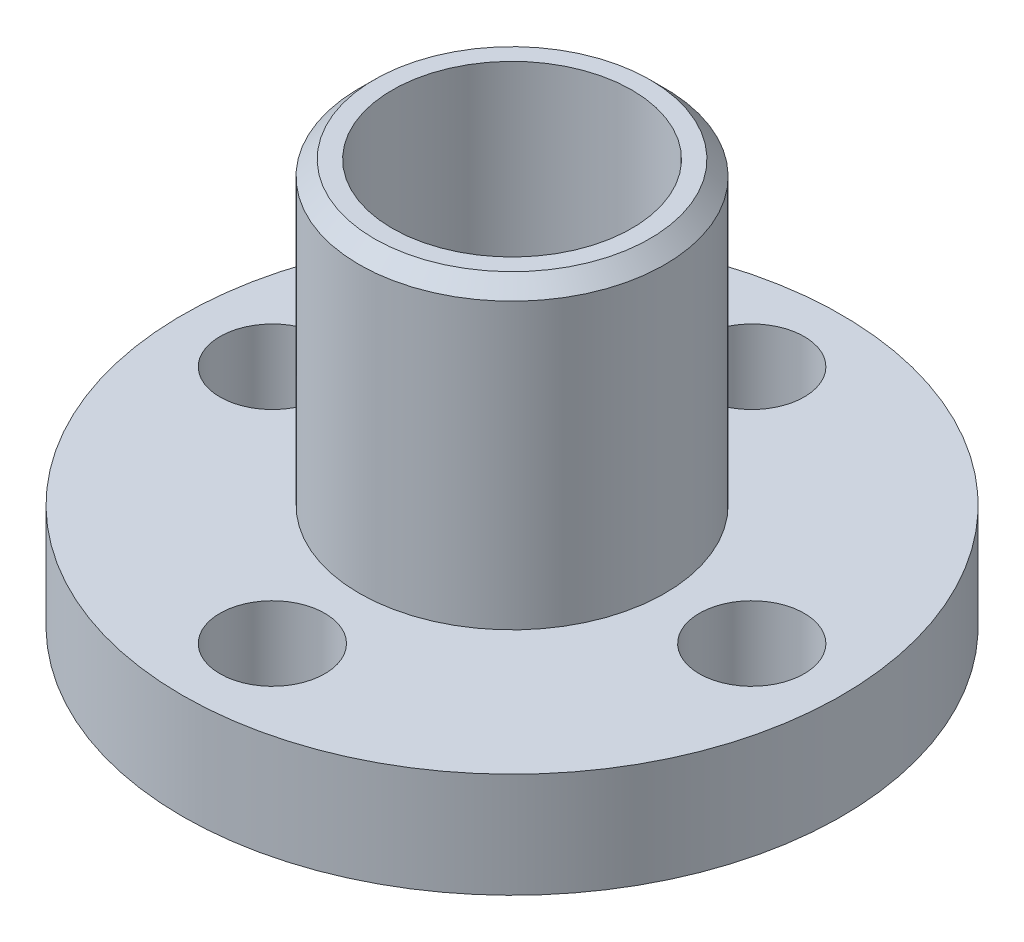
ISO-10303-21;
HEADER;
FILE_DESCRIPTION(('STEP AP214'),'2;1');
FILE_NAME('part.step','',(''),(''),'','','');
FILE_SCHEMA(('AUTOMOTIVE_DESIGN { 1 0 10303 214 1 1 1 1 }'));
ENDSEC;
DATA;
#1=APPLICATION_CONTEXT('core data for automotive mechanical design processes');
#2=APPLICATION_PROTOCOL_DEFINITION('international standard','automotive_design',2000,#1);
#3=PRODUCT_CONTEXT('',#1,'mechanical');
#4=PRODUCT('Part','Part','',(#3));
#5=PRODUCT_RELATED_PRODUCT_CATEGORY('part','',(#4));
#6=PRODUCT_DEFINITION_FORMATION('','',#4);
#7=PRODUCT_DEFINITION_CONTEXT('part definition',#1,'design');
#8=PRODUCT_DEFINITION('design','',#6,#7);
#9=PRODUCT_DEFINITION_SHAPE('','',#8);
#10=(LENGTH_UNIT() NAMED_UNIT(*) SI_UNIT(.MILLI.,.METRE.));
#11=(NAMED_UNIT(*) PLANE_ANGLE_UNIT() SI_UNIT($,.RADIAN.));
#12=(NAMED_UNIT(*) SI_UNIT($,.STERADIAN.) SOLID_ANGLE_UNIT());
#13=UNCERTAINTY_MEASURE_WITH_UNIT(LENGTH_MEASURE(1.E-05),#10,'distance_accuracy_value','');
#14=(GEOMETRIC_REPRESENTATION_CONTEXT(3) GLOBAL_UNCERTAINTY_ASSIGNED_CONTEXT((#13)) GLOBAL_UNIT_ASSIGNED_CONTEXT((#10,
#11,#12)) REPRESENTATION_CONTEXT('',''));
#15=CARTESIAN_POINT('',(0.,0.,0.));
#16=DIRECTION('',(0.,0.,1.));
#17=DIRECTION('',(1.,0.,0.));
#18=AXIS2_PLACEMENT_3D('',#15,#16,#17);
#19=CARTESIAN_POINT('',(0.,0.,0.));
#20=DIRECTION('',(0.,1.,0.));
#21=DIRECTION('',(0.,0.,1.));
#22=AXIS2_PLACEMENT_3D('',#19,#20,#21);
#23=PLANE('',#22);
#24=CARTESIAN_POINT('',(0.,0.,-8.));
#25=DIRECTION('',(0.,1.,0.));
#26=DIRECTION('',(0.,0.,1.));
#27=AXIS2_PLACEMENT_3D('',#24,#25,#26);
#28=CIRCLE('',#27,1.75);
#29=CARTESIAN_POINT('',(0.,0.,-6.25));
#30=VERTEX_POINT('',#29);
#31=EDGE_CURVE('E85',#30,#30,#28,.T.);
#32=ORIENTED_EDGE('',*,*,#31,.T.);
#33=EDGE_LOOP('',(#32));
#34=FACE_BOUND('',#33,.T.);
#35=CARTESIAN_POINT('',(8.00000000000023,0.,-2.26393958003914E-13));
#36=DIRECTION('',(0.,1.,0.));
#37=DIRECTION('',(0.,0.,1.));
#38=AXIS2_PLACEMENT_3D('',#35,#36,#37);
#39=CIRCLE('',#38,1.75000000000018);
#40=CARTESIAN_POINT('',(8.00000000000023,0.,1.74999999999995));
#41=VERTEX_POINT('',#40);
#42=EDGE_CURVE('E89',#41,#41,#39,.T.);
#43=ORIENTED_EDGE('',*,*,#42,.T.);
#44=EDGE_LOOP('',(#43));
#45=FACE_BOUND('',#44,.T.);
#46=CARTESIAN_POINT('',(4.52787916007828E-13,0.,8.));
#47=DIRECTION('',(0.,1.,0.));
#48=DIRECTION('',(0.,0.,1.));
#49=AXIS2_PLACEMENT_3D('',#46,#47,#48);
#50=CIRCLE('',#49,1.75000000000049);
#51=CARTESIAN_POINT('',(4.52787916007828E-13,0.,9.75000000000048));
#52=VERTEX_POINT('',#51);
#53=EDGE_CURVE('E93',#52,#52,#50,.T.);
#54=ORIENTED_EDGE('',*,*,#53,.T.);
#55=EDGE_LOOP('',(#54));
#56=FACE_BOUND('',#55,.T.);
#57=CARTESIAN_POINT('',(-7.99999999999977,0.,2.27373675443232E-13));
#58=DIRECTION('',(0.,1.,0.));
#59=DIRECTION('',(0.,0.,1.));
#60=AXIS2_PLACEMENT_3D('',#57,#58,#59);
#61=CIRCLE('',#60,1.75000000000036);
#62=CARTESIAN_POINT('',(-7.99999999999977,0.,1.75000000000059));
#63=VERTEX_POINT('',#62);
#64=EDGE_CURVE('E97',#63,#63,#61,.T.);
#65=ORIENTED_EDGE('',*,*,#64,.T.);
#66=EDGE_LOOP('',(#65));
#67=FACE_BOUND('',#66,.T.);
#68=CARTESIAN_POINT('',(0.,0.,0.));
#69=DIRECTION('',(0.,1.,0.));
#70=DIRECTION('',(0.,0.,1.));
#71=AXIS2_PLACEMENT_3D('',#68,#69,#70);
#72=CIRCLE('',#71,11.);
#73=CARTESIAN_POINT('',(0.,0.,11.));
#74=VERTEX_POINT('',#73);
#75=EDGE_CURVE('E66',#74,#74,#72,.T.);
#76=ORIENTED_EDGE('',*,*,#75,.F.);
#77=EDGE_LOOP('',(#76));
#78=FACE_BOUND('',#77,.T.);
#79=CARTESIAN_POINT('',(0.,0.,0.));
#80=DIRECTION('',(0.,1.,0.));
#81=DIRECTION('',(0.,0.,1.));
#82=AXIS2_PLACEMENT_3D('',#79,#80,#81);
#83=CIRCLE('',#82,5.1);
#84=CARTESIAN_POINT('',(0.,0.,5.1));
#85=VERTEX_POINT('',#84);
#86=EDGE_CURVE('E61',#85,#85,#83,.F.);
#87=ORIENTED_EDGE('',*,*,#86,.F.);
#88=EDGE_LOOP('',(#87));
#89=FACE_BOUND('',#88,.T.);
#90=ADVANCED_FACE('F37',(#34,#45,#56,#67,#78,#89),#23,.F.);
#91=CARTESIAN_POINT('',(0.,3.5,0.));
#92=DIRECTION('',(0.,1.,0.));
#93=DIRECTION('',(0.,0.,1.));
#94=AXIS2_PLACEMENT_3D('',#91,#92,#93);
#95=PLANE('',#94);
#96=CARTESIAN_POINT('',(0.,3.5,-8.));
#97=DIRECTION('',(0.,1.,0.));
#98=DIRECTION('',(0.,0.,1.));
#99=AXIS2_PLACEMENT_3D('',#96,#97,#98);
#100=CIRCLE('',#99,1.75);
#101=CARTESIAN_POINT('',(0.,3.5,-6.25));
#102=VERTEX_POINT('',#101);
#103=EDGE_CURVE('E101',#102,#102,#100,.T.);
#104=ORIENTED_EDGE('',*,*,#103,.F.);
#105=EDGE_LOOP('',(#104));
#106=FACE_BOUND('',#105,.T.);
#107=CARTESIAN_POINT('',(8.00000000000023,3.5,-2.26393958003914E-13));
#108=DIRECTION('',(0.,1.,0.));
#109=DIRECTION('',(0.,0.,1.));
#110=AXIS2_PLACEMENT_3D('',#107,#108,#109);
#111=CIRCLE('',#110,1.75000000000018);
#112=CARTESIAN_POINT('',(8.00000000000023,3.5,1.74999999999995));
#113=VERTEX_POINT('',#112);
#114=EDGE_CURVE('E110',#113,#113,#111,.T.);
#115=ORIENTED_EDGE('',*,*,#114,.F.);
#116=EDGE_LOOP('',(#115));
#117=FACE_BOUND('',#116,.T.);
#118=CARTESIAN_POINT('',(4.52787916007828E-13,3.5,8.));
#119=DIRECTION('',(0.,1.,0.));
#120=DIRECTION('',(0.,0.,1.));
#121=AXIS2_PLACEMENT_3D('',#118,#119,#120);
#122=CIRCLE('',#121,1.75000000000049);
#123=CARTESIAN_POINT('',(4.52787916007828E-13,3.5,9.75000000000048));
#124=VERTEX_POINT('',#123);
#125=EDGE_CURVE('E106',#124,#124,#122,.T.);
#126=ORIENTED_EDGE('',*,*,#125,.F.);
#127=EDGE_LOOP('',(#126));
#128=FACE_BOUND('',#127,.T.);
#129=CARTESIAN_POINT('',(-7.99999999999977,3.5,2.27373675443232E-13));
#130=DIRECTION('',(0.,1.,0.));
#131=DIRECTION('',(0.,0.,1.));
#132=AXIS2_PLACEMENT_3D('',#129,#130,#131);
#133=CIRCLE('',#132,1.75000000000036);
#134=CARTESIAN_POINT('',(-7.99999999999977,3.5,1.75000000000059));
#135=VERTEX_POINT('',#134);
#136=EDGE_CURVE('E102',#135,#135,#133,.T.);
#137=ORIENTED_EDGE('',*,*,#136,.F.);
#138=EDGE_LOOP('',(#137));
#139=FACE_BOUND('',#138,.T.);
#140=CARTESIAN_POINT('',(0.,3.5,0.));
#141=DIRECTION('',(0.,1.,0.));
#142=DIRECTION('',(0.,0.,1.));
#143=AXIS2_PLACEMENT_3D('',#140,#141,#142);
#144=CIRCLE('',#143,11.);
#145=CARTESIAN_POINT('',(0.,3.5,11.));
#146=VERTEX_POINT('',#145);
#147=EDGE_CURVE('E65',#146,#146,#144,.T.);
#148=ORIENTED_EDGE('',*,*,#147,.T.);
#149=EDGE_LOOP('',(#148));
#150=FACE_BOUND('',#149,.T.);
#151=CARTESIAN_POINT('',(0.,3.5,0.));
#152=DIRECTION('',(0.,1.,0.));
#153=DIRECTION('',(0.,0.,1.));
#154=AXIS2_PLACEMENT_3D('',#151,#152,#153);
#155=CIRCLE('',#154,5.1);
#156=CARTESIAN_POINT('',(0.,3.5,5.1));
#157=VERTEX_POINT('',#156);
#158=EDGE_CURVE('E70',#157,#157,#155,.T.);
#159=ORIENTED_EDGE('',*,*,#158,.F.);
#160=EDGE_LOOP('',(#159));
#161=FACE_BOUND('',#160,.T.);
#162=ADVANCED_FACE('F121',(#106,#117,#128,#139,#150,#161),#95,.T.);
#163=CARTESIAN_POINT('',(0.,3.5,0.));
#164=DIRECTION('',(0.,-1.,0.));
#165=DIRECTION('',(0.,0.,-1.));
#166=AXIS2_PLACEMENT_3D('',#163,#164,#165);
#167=CYLINDRICAL_SURFACE('',#166,11.);
#168=ORIENTED_EDGE('',*,*,#147,.F.);
#169=EDGE_LOOP('',(#168));
#170=FACE_BOUND('',#169,.T.);
#171=ORIENTED_EDGE('',*,*,#75,.T.);
#172=EDGE_LOOP('',(#171));
#173=FACE_BOUND('',#172,.T.);
#174=ADVANCED_FACE('F124',(#170,#173),#167,.T.);
#175=CARTESIAN_POINT('',(0.,0.,0.));
#176=DIRECTION('',(0.,1.,0.));
#177=DIRECTION('',(0.,0.,1.));
#178=AXIS2_PLACEMENT_3D('',#175,#176,#177);
#179=CYLINDRICAL_SURFACE('',#178,4.);
#180=CARTESIAN_POINT('',(0.,13.5,0.));
#181=DIRECTION('',(0.,1.,0.));
#182=DIRECTION('',(0.,0.,1.));
#183=AXIS2_PLACEMENT_3D('',#180,#181,#182);
#184=CIRCLE('',#183,4.);
#185=CARTESIAN_POINT('',(0.,13.5,4.));
#186=VERTEX_POINT('',#185);
#187=EDGE_CURVE('E77',#186,#186,#184,.T.);
#188=ORIENTED_EDGE('',*,*,#187,.T.);
#189=EDGE_LOOP('',(#188));
#190=FACE_BOUND('',#189,.T.);
#191=CARTESIAN_POINT('',(0.,-1.5,0.));
#192=DIRECTION('',(0.,-1.,0.));
#193=DIRECTION('',(0.,0.,-1.));
#194=AXIS2_PLACEMENT_3D('',#191,#192,#193);
#195=CIRCLE('',#194,4.);
#196=CARTESIAN_POINT('',(0.,-1.5,-4.));
#197=VERTEX_POINT('',#196);
#198=EDGE_CURVE('E81',#197,#197,#195,.T.);
#199=ORIENTED_EDGE('',*,*,#198,.T.);
#200=EDGE_LOOP('',(#199));
#201=FACE_BOUND('',#200,.T.);
#202=ADVANCED_FACE('F148',(#190,#201),#179,.F.);
#203=CARTESIAN_POINT('',(0.,13.5,0.));
#204=DIRECTION('',(0.,1.,0.));
#205=DIRECTION('',(0.,0.,1.));
#206=AXIS2_PLACEMENT_3D('',#203,#204,#205);
#207=PLANE('',#206);
#208=CARTESIAN_POINT('',(0.,13.5,0.));
#209=DIRECTION('',(0.,1.,0.));
#210=DIRECTION('',(0.,0.,1.));
#211=AXIS2_PLACEMENT_3D('',#208,#209,#210);
#212=CIRCLE('',#211,4.59999999999999);
#213=CARTESIAN_POINT('',(0.,13.5,4.59999999999999));
#214=VERTEX_POINT('',#213);
#215=EDGE_CURVE('E55',#214,#214,#212,.T.);
#216=ORIENTED_EDGE('',*,*,#215,.T.);
#217=EDGE_LOOP('',(#216));
#218=FACE_BOUND('',#217,.T.);
#219=ORIENTED_EDGE('',*,*,#187,.F.);
#220=EDGE_LOOP('',(#219));
#221=FACE_BOUND('',#220,.T.);
#222=ADVANCED_FACE('F139',(#218,#221),#207,.T.);
#223=CARTESIAN_POINT('',(0.,13.5,0.));
#224=DIRECTION('',(0.,-1.,0.));
#225=DIRECTION('',(0.,0.,-1.));
#226=AXIS2_PLACEMENT_3D('',#223,#224,#225);
#227=CYLINDRICAL_SURFACE('',#226,5.1);
#228=CARTESIAN_POINT('',(0.,13.,0.));
#229=DIRECTION('',(0.,1.,0.));
#230=DIRECTION('',(0.,0.,1.));
#231=AXIS2_PLACEMENT_3D('',#228,#229,#230);
#232=CIRCLE('',#231,5.1);
#233=CARTESIAN_POINT('',(0.,13.,5.1));
#234=VERTEX_POINT('',#233);
#235=EDGE_CURVE('E50',#234,#234,#232,.F.);
#236=ORIENTED_EDGE('',*,*,#235,.T.);
#237=EDGE_LOOP('',(#236));
#238=FACE_BOUND('',#237,.T.);
#239=ORIENTED_EDGE('',*,*,#158,.T.);
#240=EDGE_LOOP('',(#239));
#241=FACE_BOUND('',#240,.T.);
#242=ADVANCED_FACE('F136',(#238,#241),#227,.T.);
#243=CARTESIAN_POINT('',(0.,-1.5,0.));
#244=DIRECTION('',(0.,-1.,0.));
#245=DIRECTION('',(0.,0.,-1.));
#246=AXIS2_PLACEMENT_3D('',#243,#244,#245);
#247=PLANE('',#246);
#248=CARTESIAN_POINT('',(0.,-1.5,0.));
#249=DIRECTION('',(0.,-1.,0.));
#250=DIRECTION('',(0.,0.,-1.));
#251=AXIS2_PLACEMENT_3D('',#248,#249,#250);
#252=CIRCLE('',#251,4.59999999999999);
#253=CARTESIAN_POINT('',(0.,-1.5,-4.59999999999999));
#254=VERTEX_POINT('',#253);
#255=EDGE_CURVE('E45',#254,#254,#252,.T.);
#256=ORIENTED_EDGE('',*,*,#255,.T.);
#257=EDGE_LOOP('',(#256));
#258=FACE_BOUND('',#257,.T.);
#259=ORIENTED_EDGE('',*,*,#198,.F.);
#260=EDGE_LOOP('',(#259));
#261=FACE_BOUND('',#260,.T.);
#262=ADVANCED_FACE('F138',(#258,#261),#247,.T.);
#263=CARTESIAN_POINT('',(0.,-1.5,0.));
#264=DIRECTION('',(0.,1.,0.));
#265=DIRECTION('',(0.,0.,1.));
#266=AXIS2_PLACEMENT_3D('',#263,#264,#265);
#267=CYLINDRICAL_SURFACE('',#266,5.1);
#268=CARTESIAN_POINT('',(0.,-0.999999999999993,0.));
#269=DIRECTION('',(0.,-1.,0.));
#270=DIRECTION('',(0.,0.,-1.));
#271=AXIS2_PLACEMENT_3D('',#268,#269,#270);
#272=CIRCLE('',#271,5.1);
#273=CARTESIAN_POINT('',(0.,-0.999999999999993,-5.1));
#274=VERTEX_POINT('',#273);
#275=EDGE_CURVE('E10',#274,#274,#272,.F.);
#276=ORIENTED_EDGE('',*,*,#275,.T.);
#277=EDGE_LOOP('',(#276));
#278=FACE_BOUND('',#277,.T.);
#279=ORIENTED_EDGE('',*,*,#86,.T.);
#280=EDGE_LOOP('',(#279));
#281=FACE_BOUND('',#280,.T.);
#282=ADVANCED_FACE('F146',(#278,#281),#267,.T.);
#283=CARTESIAN_POINT('',(-7.99999999999977,-1.5,2.27373675443232E-13));
#284=DIRECTION('',(0.,1.,0.));
#285=DIRECTION('',(0.,0.,1.));
#286=AXIS2_PLACEMENT_3D('',#283,#284,#285);
#287=CYLINDRICAL_SURFACE('',#286,1.75000000000036);
#288=ORIENTED_EDGE('',*,*,#136,.T.);
#289=EDGE_LOOP('',(#288));
#290=FACE_BOUND('',#289,.T.);
#291=ORIENTED_EDGE('',*,*,#64,.F.);
#292=EDGE_LOOP('',(#291));
#293=FACE_BOUND('',#292,.T.);
#294=ADVANCED_FACE('F213',(#290,#293),#287,.F.);
#295=CARTESIAN_POINT('',(4.52787916007828E-13,-1.5,8.));
#296=DIRECTION('',(0.,1.,0.));
#297=DIRECTION('',(0.,0.,1.));
#298=AXIS2_PLACEMENT_3D('',#295,#296,#297);
#299=CYLINDRICAL_SURFACE('',#298,1.75000000000049);
#300=ORIENTED_EDGE('',*,*,#125,.T.);
#301=EDGE_LOOP('',(#300));
#302=FACE_BOUND('',#301,.T.);
#303=ORIENTED_EDGE('',*,*,#53,.F.);
#304=EDGE_LOOP('',(#303));
#305=FACE_BOUND('',#304,.T.);
#306=ADVANCED_FACE('F237',(#302,#305),#299,.F.);
#307=CARTESIAN_POINT('',(8.00000000000023,-1.5,-2.26393958003914E-13));
#308=DIRECTION('',(0.,1.,0.));
#309=DIRECTION('',(0.,0.,1.));
#310=AXIS2_PLACEMENT_3D('',#307,#308,#309);
#311=CYLINDRICAL_SURFACE('',#310,1.75000000000018);
#312=ORIENTED_EDGE('',*,*,#114,.T.);
#313=EDGE_LOOP('',(#312));
#314=FACE_BOUND('',#313,.T.);
#315=ORIENTED_EDGE('',*,*,#42,.F.);
#316=EDGE_LOOP('',(#315));
#317=FACE_BOUND('',#316,.T.);
#318=ADVANCED_FACE('F169',(#314,#317),#311,.F.);
#319=CARTESIAN_POINT('',(0.,-1.5,-8.));
#320=DIRECTION('',(0.,1.,0.));
#321=DIRECTION('',(0.,0.,1.));
#322=AXIS2_PLACEMENT_3D('',#319,#320,#321);
#323=CYLINDRICAL_SURFACE('',#322,1.75);
#324=ORIENTED_EDGE('',*,*,#103,.T.);
#325=EDGE_LOOP('',(#324));
#326=FACE_BOUND('',#325,.T.);
#327=ORIENTED_EDGE('',*,*,#31,.F.);
#328=EDGE_LOOP('',(#327));
#329=FACE_BOUND('',#328,.T.);
#330=ADVANCED_FACE('F118',(#326,#329),#323,.F.);
#331=CARTESIAN_POINT('',(0.,13.5,0.));
#332=DIRECTION('',(0.,-1.,0.));
#333=DIRECTION('',(0.,0.,-1.));
#334=AXIS2_PLACEMENT_3D('',#331,#332,#333);
#335=CONICAL_SURFACE('',#334,4.59999999999999,0.785398163397449);
#336=ORIENTED_EDGE('',*,*,#235,.F.);
#337=EDGE_LOOP('',(#336));
#338=FACE_BOUND('',#337,.T.);
#339=ORIENTED_EDGE('',*,*,#215,.F.);
#340=EDGE_LOOP('',(#339));
#341=FACE_BOUND('',#340,.T.);
#342=ADVANCED_FACE('F161',(#338,#341),#335,.T.);
#343=CARTESIAN_POINT('',(0.,-1.5,0.));
#344=DIRECTION('',(0.,1.,0.));
#345=DIRECTION('',(0.,0.,1.));
#346=AXIS2_PLACEMENT_3D('',#343,#344,#345);
#347=CONICAL_SURFACE('',#346,4.59999999999999,0.785398163397447);
#348=ORIENTED_EDGE('',*,*,#275,.F.);
#349=EDGE_LOOP('',(#348));
#350=FACE_BOUND('',#349,.T.);
#351=ORIENTED_EDGE('',*,*,#255,.F.);
#352=EDGE_LOOP('',(#351));
#353=FACE_BOUND('',#352,.T.);
#354=ADVANCED_FACE('F39',(#350,#353),#347,.T.);
#355=CLOSED_SHELL('',(#90,#162,#174,#202,#222,#242,#262,#282,#294,#306,#318,#330,#342,#354));
#356=MANIFOLD_SOLID_BREP('B2',#355);
#357=ADVANCED_BREP_SHAPE_REPRESENTATION('',(#18,#356),#14);
#358=SHAPE_DEFINITION_REPRESENTATION(#9,#357);
ENDSEC;
END-ISO-10303-21;
